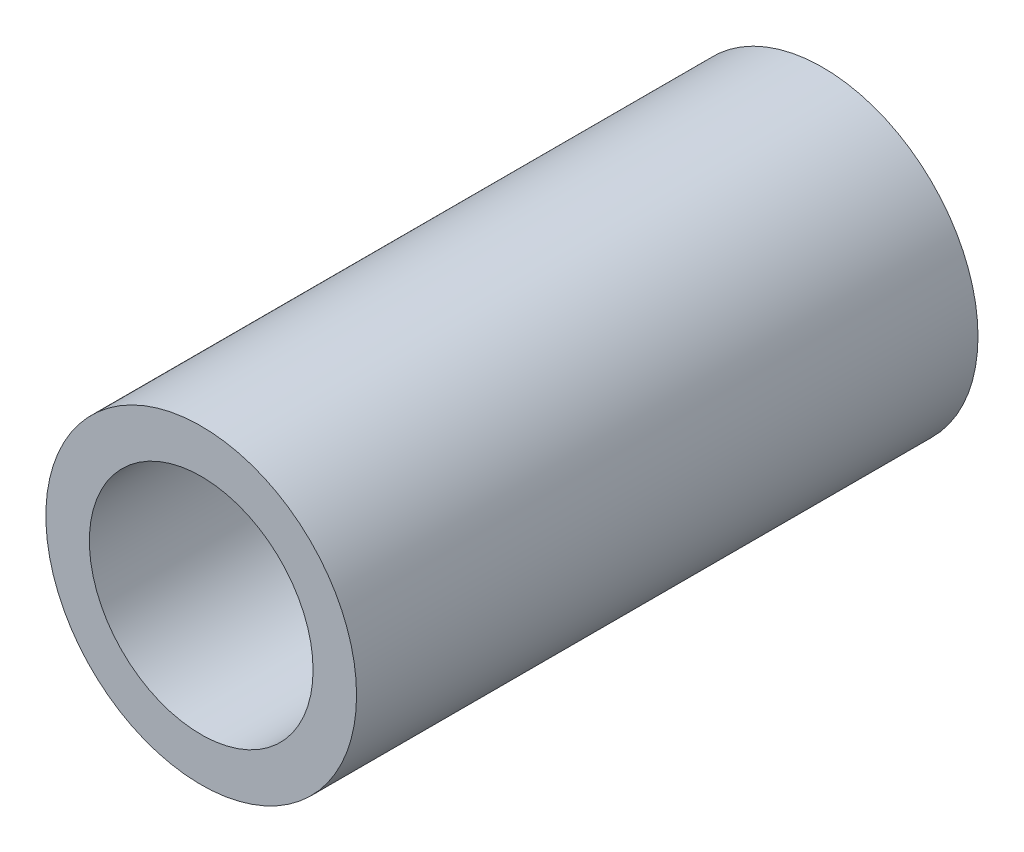
ISO-10303-21;
HEADER;
FILE_DESCRIPTION(('STEP AP214'),'2;1');
FILE_NAME('part.step','',(''),(''),'','','');
FILE_SCHEMA(('AUTOMOTIVE_DESIGN { 1 0 10303 214 1 1 1 1 }'));
ENDSEC;
DATA;
#1=APPLICATION_CONTEXT('core data for automotive mechanical design processes');
#2=APPLICATION_PROTOCOL_DEFINITION('international standard','automotive_design',2000,#1);
#3=PRODUCT_CONTEXT('',#1,'mechanical');
#4=PRODUCT('Part','Part','',(#3));
#5=PRODUCT_RELATED_PRODUCT_CATEGORY('part','',(#4));
#6=PRODUCT_DEFINITION_FORMATION('','',#4);
#7=PRODUCT_DEFINITION_CONTEXT('part definition',#1,'design');
#8=PRODUCT_DEFINITION('design','',#6,#7);
#9=PRODUCT_DEFINITION_SHAPE('','',#8);
#10=(LENGTH_UNIT() NAMED_UNIT(*) SI_UNIT(.MILLI.,.METRE.));
#11=(NAMED_UNIT(*) PLANE_ANGLE_UNIT() SI_UNIT($,.RADIAN.));
#12=(NAMED_UNIT(*) SI_UNIT($,.STERADIAN.) SOLID_ANGLE_UNIT());
#13=UNCERTAINTY_MEASURE_WITH_UNIT(LENGTH_MEASURE(1.E-05),#10,'distance_accuracy_value','');
#14=(GEOMETRIC_REPRESENTATION_CONTEXT(3) GLOBAL_UNCERTAINTY_ASSIGNED_CONTEXT((#13)) GLOBAL_UNIT_ASSIGNED_CONTEXT((#10,
#11,#12)) REPRESENTATION_CONTEXT('',''));
#15=CARTESIAN_POINT('',(0.,0.,0.));
#16=DIRECTION('',(0.,0.,1.));
#17=DIRECTION('',(1.,0.,0.));
#18=AXIS2_PLACEMENT_3D('',#15,#16,#17);
#19=CARTESIAN_POINT('',(0.,0.,3.17499999999993));
#20=DIRECTION('',(0.,0.,1.));
#21=DIRECTION('',(1.,0.,0.));
#22=AXIS2_PLACEMENT_3D('',#19,#20,#21);
#23=PLANE('',#22);
#24=CARTESIAN_POINT('',(0.,0.,3.17499999999993));
#25=DIRECTION('',(0.,0.,1.));
#26=DIRECTION('',(1.,0.,0.));
#27=AXIS2_PLACEMENT_3D('',#24,#25,#26);
#28=CIRCLE('',#27,1.5875);
#29=CARTESIAN_POINT('',(1.5875,0.,3.17499999999993));
#30=VERTEX_POINT('',#29);
#31=EDGE_CURVE('E12',#30,#30,#28,.T.);
#32=ORIENTED_EDGE('',*,*,#31,.T.);
#33=EDGE_LOOP('',(#32));
#34=FACE_BOUND('',#33,.T.);
#35=CARTESIAN_POINT('',(0.,0.,3.17499999999993));
#36=DIRECTION('',(0.,0.,1.));
#37=DIRECTION('',(1.,0.,0.));
#38=AXIS2_PLACEMENT_3D('',#35,#36,#37);
#39=CIRCLE('',#38,1.143);
#40=CARTESIAN_POINT('',(1.143,0.,3.17499999999993));
#41=VERTEX_POINT('',#40);
#42=EDGE_CURVE('E47',#41,#41,#39,.T.);
#43=ORIENTED_EDGE('',*,*,#42,.F.);
#44=EDGE_LOOP('',(#43));
#45=FACE_BOUND('',#44,.T.);
#46=ADVANCED_FACE('F40',(#34,#45),#23,.T.);
#47=CARTESIAN_POINT('',(0.,0.,3.17499999999993));
#48=DIRECTION('',(0.,0.,-1.));
#49=DIRECTION('',(-1.,0.,0.));
#50=AXIS2_PLACEMENT_3D('',#47,#48,#49);
#51=CYLINDRICAL_SURFACE('',#50,1.5875);
#52=ORIENTED_EDGE('',*,*,#31,.F.);
#53=EDGE_LOOP('',(#52));
#54=FACE_BOUND('',#53,.T.);
#55=CARTESIAN_POINT('',(0.,0.,-3.17499999999993));
#56=DIRECTION('',(0.,0.,1.));
#57=DIRECTION('',(1.,0.,0.));
#58=AXIS2_PLACEMENT_3D('',#55,#56,#57);
#59=CIRCLE('',#58,1.5875);
#60=CARTESIAN_POINT('',(1.5875,0.,-3.17499999999993));
#61=VERTEX_POINT('',#60);
#62=EDGE_CURVE('E51',#61,#61,#59,.T.);
#63=ORIENTED_EDGE('',*,*,#62,.T.);
#64=EDGE_LOOP('',(#63));
#65=FACE_BOUND('',#64,.T.);
#66=ADVANCED_FACE('F42',(#54,#65),#51,.T.);
#67=CARTESIAN_POINT('',(0.,0.,3.17499999999993));
#68=DIRECTION('',(0.,0.,-1.));
#69=DIRECTION('',(-1.,0.,0.));
#70=AXIS2_PLACEMENT_3D('',#67,#68,#69);
#71=CYLINDRICAL_SURFACE('',#70,1.143);
#72=ORIENTED_EDGE('',*,*,#42,.T.);
#73=EDGE_LOOP('',(#72));
#74=FACE_BOUND('',#73,.T.);
#75=CARTESIAN_POINT('',(0.,0.,-3.17499999999993));
#76=DIRECTION('',(0.,0.,1.));
#77=DIRECTION('',(1.,0.,0.));
#78=AXIS2_PLACEMENT_3D('',#75,#76,#77);
#79=CIRCLE('',#78,1.143);
#80=CARTESIAN_POINT('',(1.143,0.,-3.17499999999993));
#81=VERTEX_POINT('',#80);
#82=EDGE_CURVE('E55',#81,#81,#79,.T.);
#83=ORIENTED_EDGE('',*,*,#82,.F.);
#84=EDGE_LOOP('',(#83));
#85=FACE_BOUND('',#84,.T.);
#86=ADVANCED_FACE('F64',(#74,#85),#71,.F.);
#87=CARTESIAN_POINT('',(0.,0.,-3.17499999999993));
#88=DIRECTION('',(0.,0.,1.));
#89=DIRECTION('',(1.,0.,0.));
#90=AXIS2_PLACEMENT_3D('',#87,#88,#89);
#91=PLANE('',#90);
#92=ORIENTED_EDGE('',*,*,#82,.T.);
#93=EDGE_LOOP('',(#92));
#94=FACE_BOUND('',#93,.T.);
#95=ORIENTED_EDGE('',*,*,#62,.F.);
#96=EDGE_LOOP('',(#95));
#97=FACE_BOUND('',#96,.T.);
#98=ADVANCED_FACE('F61',(#94,#97),#91,.F.);
#99=CLOSED_SHELL('',(#46,#66,#86,#98));
#100=MANIFOLD_SOLID_BREP('B2',#99);
#101=ADVANCED_BREP_SHAPE_REPRESENTATION('',(#18,#100),#14);
#102=SHAPE_DEFINITION_REPRESENTATION(#9,#101);
ENDSEC;
END-ISO-10303-21;
